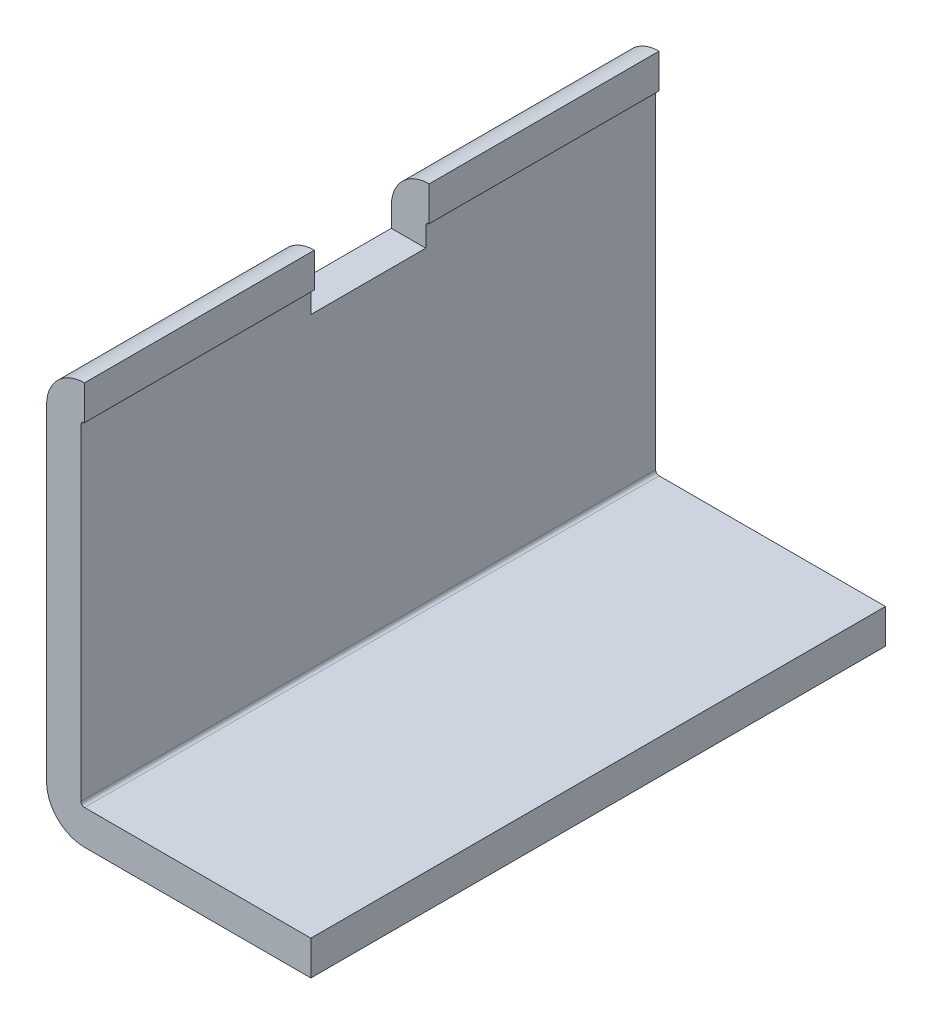
ISO-10303-21;
HEADER;
FILE_DESCRIPTION(('STEP AP214'),'2;1');
FILE_NAME('part.step','',(''),(''),'','','');
FILE_SCHEMA(('AUTOMOTIVE_DESIGN { 1 0 10303 214 1 1 1 1 }'));
ENDSEC;
DATA;
#1=APPLICATION_CONTEXT('core data for automotive mechanical design processes');
#2=APPLICATION_PROTOCOL_DEFINITION('international standard','automotive_design',2000,#1);
#3=PRODUCT_CONTEXT('',#1,'mechanical');
#4=PRODUCT('Part','Part','',(#3));
#5=PRODUCT_RELATED_PRODUCT_CATEGORY('part','',(#4));
#6=PRODUCT_DEFINITION_FORMATION('','',#4);
#7=PRODUCT_DEFINITION_CONTEXT('part definition',#1,'design');
#8=PRODUCT_DEFINITION('design','',#6,#7);
#9=PRODUCT_DEFINITION_SHAPE('','',#8);
#10=(LENGTH_UNIT() NAMED_UNIT(*) SI_UNIT(.MILLI.,.METRE.));
#11=(NAMED_UNIT(*) PLANE_ANGLE_UNIT() SI_UNIT($,.RADIAN.));
#12=(NAMED_UNIT(*) SI_UNIT($,.STERADIAN.) SOLID_ANGLE_UNIT());
#13=UNCERTAINTY_MEASURE_WITH_UNIT(LENGTH_MEASURE(1.E-05),#10,'distance_accuracy_value','');
#14=(GEOMETRIC_REPRESENTATION_CONTEXT(3) GLOBAL_UNCERTAINTY_ASSIGNED_CONTEXT((#13)) GLOBAL_UNIT_ASSIGNED_CONTEXT((#10,
#11,#12)) REPRESENTATION_CONTEXT('',''));
#15=CARTESIAN_POINT('',(0.,0.,0.));
#16=DIRECTION('',(0.,0.,1.));
#17=DIRECTION('',(1.,0.,0.));
#18=AXIS2_PLACEMENT_3D('',#15,#16,#17);
#19=CARTESIAN_POINT('',(0.03,0.,5.));
#20=DIRECTION('',(0.,0.,-1.));
#21=DIRECTION('',(-1.,0.,0.));
#22=AXIS2_PLACEMENT_3D('',#19,#20,#21);
#23=CYLINDRICAL_SURFACE('',#22,0.03);
#24=CARTESIAN_POINT('',(0.03,0.,3.));
#25=DIRECTION('',(0.,0.,1.));
#26=DIRECTION('',(1.,0.,0.));
#27=AXIS2_PLACEMENT_3D('',#24,#25,#26);
#28=CIRCLE('',#27,0.03);
#29=CARTESIAN_POINT('',(0.03,0.03,3.));
#30=VERTEX_POINT('',#29);
#31=CARTESIAN_POINT('',(0.,0.,3.));
#32=VERTEX_POINT('',#31);
#33=EDGE_CURVE('E258',#30,#32,#28,.T.);
#34=ORIENTED_EDGE('',*,*,#33,.F.);
#35=DIRECTION('',(0.,0.,-1.));
#36=VECTOR('',#35,1.);
#37=CARTESIAN_POINT('',(0.03,0.03,5.));
#38=LINE('',#37,#36);
#39=CARTESIAN_POINT('',(0.03,0.03,5.));
#40=VERTEX_POINT('',#39);
#41=EDGE_CURVE('E197',#40,#30,#38,.T.);
#42=ORIENTED_EDGE('',*,*,#41,.F.);
#43=CARTESIAN_POINT('',(0.03,0.,5.));
#44=DIRECTION('',(0.,0.,1.));
#45=DIRECTION('',(-1.,0.,0.));
#46=AXIS2_PLACEMENT_3D('',#43,#44,#45);
#47=CIRCLE('',#46,0.03);
#48=CARTESIAN_POINT('',(0.,0.,5.));
#49=VERTEX_POINT('',#48);
#50=EDGE_CURVE('E237',#40,#49,#47,.T.);
#51=ORIENTED_EDGE('',*,*,#50,.T.);
#52=DIRECTION('',(0.,0.,-1.));
#53=VECTOR('',#52,1.);
#54=CARTESIAN_POINT('',(0.,0.,5.));
#55=LINE('',#54,#53);
#56=EDGE_CURVE('E201',#49,#32,#55,.T.);
#57=ORIENTED_EDGE('',*,*,#56,.T.);
#58=EDGE_LOOP('',(#34,#42,#51,#57));
#59=FACE_BOUND('',#58,.T.);
#60=ADVANCED_FACE('F41',(#59),#23,.F.);
#61=CARTESIAN_POINT('',(0.0299999999999999,0.33,5.));
#62=DIRECTION('',(1.,0.,0.));
#63=DIRECTION('',(0.,1.,0.));
#64=AXIS2_PLACEMENT_3D('',#61,#62,#63);
#65=PLANE('',#64);
#66=DIRECTION('',(0.,-1.,0.));
#67=VECTOR('',#66,1.);
#68=CARTESIAN_POINT('',(0.0299999999999999,0.33,3.));
#69=LINE('',#68,#67);
#70=CARTESIAN_POINT('',(0.03,0.33,3.));
#71=VERTEX_POINT('',#70);
#72=EDGE_CURVE('E245',#71,#30,#69,.T.);
#73=ORIENTED_EDGE('',*,*,#72,.F.);
#74=DIRECTION('',(0.,0.,-1.));
#75=VECTOR('',#74,1.);
#76=CARTESIAN_POINT('',(0.0299999999999999,0.33,5.));
#77=LINE('',#76,#75);
#78=CARTESIAN_POINT('',(0.0299999999999999,0.33,5.));
#79=VERTEX_POINT('',#78);
#80=EDGE_CURVE('E194',#79,#71,#77,.T.);
#81=ORIENTED_EDGE('',*,*,#80,.F.);
#82=DIRECTION('',(0.,-1.,0.));
#83=VECTOR('',#82,1.);
#84=CARTESIAN_POINT('',(0.0299999999999999,0.33,5.));
#85=LINE('',#84,#83);
#86=EDGE_CURVE('E142',#79,#40,#85,.T.);
#87=ORIENTED_EDGE('',*,*,#86,.T.);
#88=ORIENTED_EDGE('',*,*,#41,.T.);
#89=EDGE_LOOP('',(#73,#81,#87,#88));
#90=FACE_BOUND('',#89,.T.);
#91=ADVANCED_FACE('F241',(#90),#65,.T.);
#92=CARTESIAN_POINT('',(0.03,0.,5.));
#93=DIRECTION('',(0.,0.,-1.));
#94=DIRECTION('',(-1.,0.,0.));
#95=AXIS2_PLACEMENT_3D('',#92,#93,#94);
#96=CYLINDRICAL_SURFACE('',#95,0.33);
#97=ORIENTED_EDGE('',*,*,#80,.T.);
#98=CARTESIAN_POINT('',(0.03,0.,3.));
#99=DIRECTION('',(0.,0.,1.));
#100=DIRECTION('',(1.,0.,0.));
#101=AXIS2_PLACEMENT_3D('',#98,#99,#100);
#102=CIRCLE('',#101,0.33);
#103=CARTESIAN_POINT('',(-0.3,0.,3.));
#104=VERTEX_POINT('',#103);
#105=EDGE_CURVE('E152',#71,#104,#102,.T.);
#106=ORIENTED_EDGE('',*,*,#105,.T.);
#107=DIRECTION('',(0.,0.,-1.));
#108=VECTOR('',#107,1.);
#109=CARTESIAN_POINT('',(-0.3,0.,5.));
#110=LINE('',#109,#108);
#111=CARTESIAN_POINT('',(-0.3,0.,5.));
#112=VERTEX_POINT('',#111);
#113=EDGE_CURVE('E148',#112,#104,#110,.T.);
#114=ORIENTED_EDGE('',*,*,#113,.F.);
#115=CARTESIAN_POINT('',(0.03,0.,5.));
#116=DIRECTION('',(0.,0.,1.));
#117=DIRECTION('',(1.,0.,0.));
#118=AXIS2_PLACEMENT_3D('',#115,#116,#117);
#119=CIRCLE('',#118,0.33);
#120=EDGE_CURVE('E134',#79,#112,#119,.T.);
#121=ORIENTED_EDGE('',*,*,#120,.F.);
#122=EDGE_LOOP('',(#97,#106,#114,#121));
#123=FACE_BOUND('',#122,.T.);
#124=ADVANCED_FACE('F149',(#123),#96,.T.);
#125=CARTESIAN_POINT('',(0.0300000000000003,-3.17,5.));
#126=DIRECTION('',(0.,1.,0.));
#127=DIRECTION('',(-1.,0.,0.));
#128=AXIS2_PLACEMENT_3D('',#125,#126,#127);
#129=PLANE('',#128);
#130=DIRECTION('',(1.,0.,0.));
#131=VECTOR('',#130,1.);
#132=CARTESIAN_POINT('',(0.0300000000000003,-3.17,0.));
#133=LINE('',#132,#131);
#134=CARTESIAN_POINT('',(0.0300000000000003,-3.17,0.));
#135=VERTEX_POINT('',#134);
#136=CARTESIAN_POINT('',(2.,-3.17,0.));
#137=VERTEX_POINT('',#136);
#138=EDGE_CURVE('E164',#135,#137,#133,.T.);
#139=ORIENTED_EDGE('',*,*,#138,.T.);
#140=DIRECTION('',(0.,0.,-1.));
#141=VECTOR('',#140,1.);
#142=CARTESIAN_POINT('',(2.,-3.17,5.));
#143=LINE('',#142,#141);
#144=CARTESIAN_POINT('',(2.,-3.17,5.));
#145=VERTEX_POINT('',#144);
#146=EDGE_CURVE('E49',#145,#137,#143,.T.);
#147=ORIENTED_EDGE('',*,*,#146,.F.);
#148=DIRECTION('',(1.,0.,0.));
#149=VECTOR('',#148,1.);
#150=CARTESIAN_POINT('',(0.0300000000000003,-3.17,5.));
#151=LINE('',#150,#149);
#152=CARTESIAN_POINT('',(0.0300000000000003,-3.17,5.));
#153=VERTEX_POINT('',#152);
#154=EDGE_CURVE('E110',#153,#145,#151,.T.);
#155=ORIENTED_EDGE('',*,*,#154,.F.);
#156=DIRECTION('',(0.,0.,-1.));
#157=VECTOR('',#156,1.);
#158=CARTESIAN_POINT('',(0.0300000000000003,-3.17,5.));
#159=LINE('',#158,#157);
#160=EDGE_CURVE('E160',#153,#135,#159,.T.);
#161=ORIENTED_EDGE('',*,*,#160,.T.);
#162=EDGE_LOOP('',(#139,#147,#155,#161));
#163=FACE_BOUND('',#162,.T.);
#164=ADVANCED_FACE('F43',(#163),#129,.F.);
#165=CARTESIAN_POINT('',(2.,-2.87,5.));
#166=DIRECTION('',(1.,0.,0.));
#167=DIRECTION('',(0.,1.,0.));
#168=AXIS2_PLACEMENT_3D('',#165,#166,#167);
#169=PLANE('',#168);
#170=DIRECTION('',(0.,-1.,0.));
#171=VECTOR('',#170,1.);
#172=CARTESIAN_POINT('',(2.,-2.87,0.));
#173=LINE('',#172,#171);
#174=CARTESIAN_POINT('',(2.,-2.87,0.));
#175=VERTEX_POINT('',#174);
#176=EDGE_CURVE('E167',#175,#137,#173,.T.);
#177=ORIENTED_EDGE('',*,*,#176,.F.);
#178=DIRECTION('',(0.,0.,-1.));
#179=VECTOR('',#178,1.);
#180=CARTESIAN_POINT('',(2.,-2.87,5.));
#181=LINE('',#180,#179);
#182=CARTESIAN_POINT('',(2.,-2.87,5.));
#183=VERTEX_POINT('',#182);
#184=EDGE_CURVE('E208',#183,#175,#181,.T.);
#185=ORIENTED_EDGE('',*,*,#184,.F.);
#186=DIRECTION('',(0.,-1.,0.));
#187=VECTOR('',#186,1.);
#188=CARTESIAN_POINT('',(2.,-2.87,5.));
#189=LINE('',#188,#187);
#190=EDGE_CURVE('E213',#183,#145,#189,.T.);
#191=ORIENTED_EDGE('',*,*,#190,.T.);
#192=ORIENTED_EDGE('',*,*,#146,.T.);
#193=EDGE_LOOP('',(#177,#185,#191,#192));
#194=FACE_BOUND('',#193,.T.);
#195=ADVANCED_FACE('F212',(#194),#169,.T.);
#196=CARTESIAN_POINT('',(0.0300000000000003,-2.87,5.));
#197=DIRECTION('',(0.,1.,0.));
#198=DIRECTION('',(-1.,0.,0.));
#199=AXIS2_PLACEMENT_3D('',#196,#197,#198);
#200=PLANE('',#199);
#201=DIRECTION('',(1.,0.,0.));
#202=VECTOR('',#201,1.);
#203=CARTESIAN_POINT('',(0.0300000000000003,-2.87,0.));
#204=LINE('',#203,#202);
#205=CARTESIAN_POINT('',(0.0300000000000003,-2.87,0.));
#206=VERTEX_POINT('',#205);
#207=EDGE_CURVE('E171',#206,#175,#204,.T.);
#208=ORIENTED_EDGE('',*,*,#207,.F.);
#209=DIRECTION('',(0.,0.,-1.));
#210=VECTOR('',#209,1.);
#211=CARTESIAN_POINT('',(0.0300000000000003,-2.87,5.));
#212=LINE('',#211,#210);
#213=CARTESIAN_POINT('',(0.0300000000000003,-2.87,5.));
#214=VERTEX_POINT('',#213);
#215=EDGE_CURVE('E206',#214,#206,#212,.T.);
#216=ORIENTED_EDGE('',*,*,#215,.F.);
#217=DIRECTION('',(1.,0.,0.));
#218=VECTOR('',#217,1.);
#219=CARTESIAN_POINT('',(0.0300000000000003,-2.87,5.));
#220=LINE('',#219,#218);
#221=EDGE_CURVE('E224',#214,#183,#220,.T.);
#222=ORIENTED_EDGE('',*,*,#221,.T.);
#223=ORIENTED_EDGE('',*,*,#184,.T.);
#224=EDGE_LOOP('',(#208,#216,#222,#223));
#225=FACE_BOUND('',#224,.T.);
#226=ADVANCED_FACE('F221',(#225),#200,.T.);
#227=CARTESIAN_POINT('',(0.0300000000000003,-2.84,5.));
#228=DIRECTION('',(0.,0.,-1.));
#229=DIRECTION('',(-1.,0.,0.));
#230=AXIS2_PLACEMENT_3D('',#227,#228,#229);
#231=CYLINDRICAL_SURFACE('',#230,0.0299999999999998);
#232=CARTESIAN_POINT('',(0.0300000000000003,-2.84,0.));
#233=DIRECTION('',(0.,0.,1.));
#234=DIRECTION('',(1.,0.,0.));
#235=AXIS2_PLACEMENT_3D('',#232,#233,#234);
#236=CIRCLE('',#235,0.0299999999999998);
#237=CARTESIAN_POINT('',(0.,-2.84,0.));
#238=VERTEX_POINT('',#237);
#239=EDGE_CURVE('E174',#238,#206,#236,.T.);
#240=ORIENTED_EDGE('',*,*,#239,.F.);
#241=DIRECTION('',(0.,0.,-1.));
#242=VECTOR('',#241,1.);
#243=CARTESIAN_POINT('',(0.,-2.84,5.));
#244=LINE('',#243,#242);
#245=CARTESIAN_POINT('',(0.,-2.84,5.));
#246=VERTEX_POINT('',#245);
#247=EDGE_CURVE('E204',#246,#238,#244,.T.);
#248=ORIENTED_EDGE('',*,*,#247,.F.);
#249=CARTESIAN_POINT('',(0.0300000000000003,-2.84,5.));
#250=DIRECTION('',(0.,0.,1.));
#251=DIRECTION('',(1.,0.,0.));
#252=AXIS2_PLACEMENT_3D('',#249,#250,#251);
#253=CIRCLE('',#252,0.0299999999999998);
#254=EDGE_CURVE('E228',#246,#214,#253,.T.);
#255=ORIENTED_EDGE('',*,*,#254,.T.);
#256=ORIENTED_EDGE('',*,*,#215,.T.);
#257=EDGE_LOOP('',(#240,#248,#255,#256));
#258=FACE_BOUND('',#257,.T.);
#259=ADVANCED_FACE('F276',(#258),#231,.F.);
#260=CARTESIAN_POINT('',(0.,0.,5.));
#261=DIRECTION('',(1.,0.,0.));
#262=DIRECTION('',(0.,1.,0.));
#263=AXIS2_PLACEMENT_3D('',#260,#261,#262);
#264=PLANE('',#263);
#265=DIRECTION('',(0.,-1.,0.));
#266=VECTOR('',#265,1.);
#267=CARTESIAN_POINT('',(0.,0.,3.));
#268=LINE('',#267,#266);
#269=CARTESIAN_POINT('',(0.,-0.17,3.));
#270=VERTEX_POINT('',#269);
#271=EDGE_CURVE('E168',#32,#270,#268,.T.);
#272=ORIENTED_EDGE('',*,*,#271,.F.);
#273=ORIENTED_EDGE('',*,*,#56,.F.);
#274=DIRECTION('',(0.,-1.,0.));
#275=VECTOR('',#274,1.);
#276=CARTESIAN_POINT('',(0.,0.,5.));
#277=LINE('',#276,#275);
#278=EDGE_CURVE('E234',#49,#246,#277,.T.);
#279=ORIENTED_EDGE('',*,*,#278,.T.);
#280=ORIENTED_EDGE('',*,*,#247,.T.);
#281=DIRECTION('',(0.,-1.,0.));
#282=VECTOR('',#281,1.);
#283=CARTESIAN_POINT('',(0.,0.,0.));
#284=LINE('',#283,#282);
#285=CARTESIAN_POINT('',(0.,0.,0.));
#286=VERTEX_POINT('',#285);
#287=EDGE_CURVE('E177',#286,#238,#284,.T.);
#288=ORIENTED_EDGE('',*,*,#287,.F.);
#289=CARTESIAN_POINT('',(0.,0.,2.));
#290=VERTEX_POINT('',#289);
#291=EDGE_CURVE('E200',#290,#286,#55,.T.);
#292=ORIENTED_EDGE('',*,*,#291,.F.);
#293=DIRECTION('',(0.,1.,0.));
#294=VECTOR('',#293,1.);
#295=CARTESIAN_POINT('',(0.,0.,2.));
#296=LINE('',#295,#294);
#297=CARTESIAN_POINT('',(0.,-0.17,2.));
#298=VERTEX_POINT('',#297);
#299=EDGE_CURVE('E287',#298,#290,#296,.T.);
#300=ORIENTED_EDGE('',*,*,#299,.F.);
#301=DIRECTION('',(0.,0.,-1.));
#302=VECTOR('',#301,1.);
#303=CARTESIAN_POINT('',(0.,-0.17,5.));
#304=LINE('',#303,#302);
#305=EDGE_CURVE('E272',#270,#298,#304,.T.);
#306=ORIENTED_EDGE('',*,*,#305,.F.);
#307=EDGE_LOOP('',(#272,#273,#279,#280,#288,#292,#300,#306));
#308=FACE_BOUND('',#307,.T.);
#309=ADVANCED_FACE('F268',(#308),#264,.T.);
#310=CARTESIAN_POINT('',(0.03,0.,2.));
#311=DIRECTION('',(0.,0.,-1.));
#312=DIRECTION('',(-1.,0.,0.));
#313=AXIS2_PLACEMENT_3D('',#310,#311,#312);
#314=CIRCLE('',#313,0.03);
#315=CARTESIAN_POINT('',(0.03,0.03,2.));
#316=VERTEX_POINT('',#315);
#317=EDGE_CURVE('E285',#290,#316,#314,.T.);
#318=ORIENTED_EDGE('',*,*,#317,.F.);
#319=ORIENTED_EDGE('',*,*,#291,.T.);
#320=CARTESIAN_POINT('',(0.03,0.,0.));
#321=DIRECTION('',(0.,0.,1.));
#322=DIRECTION('',(-1.,0.,0.));
#323=AXIS2_PLACEMENT_3D('',#320,#321,#322);
#324=CIRCLE('',#323,0.03);
#325=CARTESIAN_POINT('',(0.03,0.03,0.));
#326=VERTEX_POINT('',#325);
#327=EDGE_CURVE('E180',#326,#286,#324,.T.);
#328=ORIENTED_EDGE('',*,*,#327,.F.);
#329=EDGE_CURVE('E196',#316,#326,#38,.T.);
#330=ORIENTED_EDGE('',*,*,#329,.F.);
#331=EDGE_LOOP('',(#318,#319,#328,#330));
#332=FACE_BOUND('',#331,.T.);
#333=ADVANCED_FACE('F283',(#332),#23,.F.);
#334=DIRECTION('',(0.,1.,0.));
#335=VECTOR('',#334,1.);
#336=CARTESIAN_POINT('',(0.0299999999999999,0.33,2.));
#337=LINE('',#336,#335);
#338=CARTESIAN_POINT('',(0.03,0.33,2.));
#339=VERTEX_POINT('',#338);
#340=EDGE_CURVE('E292',#316,#339,#337,.T.);
#341=ORIENTED_EDGE('',*,*,#340,.F.);
#342=ORIENTED_EDGE('',*,*,#329,.T.);
#343=DIRECTION('',(0.,-1.,0.));
#344=VECTOR('',#343,1.);
#345=CARTESIAN_POINT('',(0.0299999999999999,0.33,0.));
#346=LINE('',#345,#344);
#347=CARTESIAN_POINT('',(0.0299999999999999,0.33,0.));
#348=VERTEX_POINT('',#347);
#349=EDGE_CURVE('E183',#348,#326,#346,.T.);
#350=ORIENTED_EDGE('',*,*,#349,.F.);
#351=EDGE_CURVE('E154',#339,#348,#77,.T.);
#352=ORIENTED_EDGE('',*,*,#351,.F.);
#353=EDGE_LOOP('',(#341,#342,#350,#352));
#354=FACE_BOUND('',#353,.T.);
#355=ADVANCED_FACE('F323',(#354),#65,.T.);
#356=CARTESIAN_POINT('',(-0.3,0.,2.));
#357=VERTEX_POINT('',#356);
#358=CARTESIAN_POINT('',(-0.3,0.,0.));
#359=VERTEX_POINT('',#358);
#360=EDGE_CURVE('E155',#357,#359,#110,.T.);
#361=ORIENTED_EDGE('',*,*,#360,.F.);
#362=CARTESIAN_POINT('',(0.03,0.,2.));
#363=DIRECTION('',(0.,0.,-1.));
#364=DIRECTION('',(-1.,0.,0.));
#365=AXIS2_PLACEMENT_3D('',#362,#363,#364);
#366=CIRCLE('',#365,0.33);
#367=EDGE_CURVE('E298',#357,#339,#366,.T.);
#368=ORIENTED_EDGE('',*,*,#367,.T.);
#369=ORIENTED_EDGE('',*,*,#351,.T.);
#370=CARTESIAN_POINT('',(0.03,0.,0.));
#371=DIRECTION('',(0.,0.,1.));
#372=DIRECTION('',(1.,0.,0.));
#373=AXIS2_PLACEMENT_3D('',#370,#371,#372);
#374=CIRCLE('',#373,0.33);
#375=EDGE_CURVE('E186',#348,#359,#374,.T.);
#376=ORIENTED_EDGE('',*,*,#375,.T.);
#377=EDGE_LOOP('',(#361,#368,#369,#376));
#378=FACE_BOUND('',#377,.T.);
#379=ADVANCED_FACE('F325',(#378),#96,.T.);
#380=CARTESIAN_POINT('',(-0.3,0.,5.));
#381=DIRECTION('',(1.,0.,0.));
#382=DIRECTION('',(0.,1.,0.));
#383=AXIS2_PLACEMENT_3D('',#380,#381,#382);
#384=PLANE('',#383);
#385=ORIENTED_EDGE('',*,*,#113,.T.);
#386=DIRECTION('',(0.,-1.,0.));
#387=VECTOR('',#386,1.);
#388=CARTESIAN_POINT('',(-0.3,0.,3.));
#389=LINE('',#388,#387);
#390=CARTESIAN_POINT('',(-0.3,-0.17,3.));
#391=VERTEX_POINT('',#390);
#392=EDGE_CURVE('E11',#104,#391,#389,.T.);
#393=ORIENTED_EDGE('',*,*,#392,.T.);
#394=DIRECTION('',(0.,0.,-1.));
#395=VECTOR('',#394,1.);
#396=CARTESIAN_POINT('',(-0.3,-0.17,2.));
#397=LINE('',#396,#395);
#398=CARTESIAN_POINT('',(-0.3,-0.17,2.));
#399=VERTEX_POINT('',#398);
#400=EDGE_CURVE('E307',#391,#399,#397,.T.);
#401=ORIENTED_EDGE('',*,*,#400,.T.);
#402=DIRECTION('',(0.,1.,0.));
#403=VECTOR('',#402,1.);
#404=CARTESIAN_POINT('',(-0.3,-0.17,2.));
#405=LINE('',#404,#403);
#406=EDGE_CURVE('E56',#399,#357,#405,.T.);
#407=ORIENTED_EDGE('',*,*,#406,.T.);
#408=ORIENTED_EDGE('',*,*,#360,.T.);
#409=DIRECTION('',(0.,-1.,0.));
#410=VECTOR('',#409,1.);
#411=CARTESIAN_POINT('',(-0.3,0.,0.));
#412=LINE('',#411,#410);
#413=CARTESIAN_POINT('',(-0.299999999999999,-2.84,0.));
#414=VERTEX_POINT('',#413);
#415=EDGE_CURVE('E189',#359,#414,#412,.T.);
#416=ORIENTED_EDGE('',*,*,#415,.T.);
#417=DIRECTION('',(0.,0.,-1.));
#418=VECTOR('',#417,1.);
#419=CARTESIAN_POINT('',(-0.299999999999999,-2.84,5.));
#420=LINE('',#419,#418);
#421=CARTESIAN_POINT('',(-0.299999999999999,-2.84,5.));
#422=VERTEX_POINT('',#421);
#423=EDGE_CURVE('E158',#422,#414,#420,.T.);
#424=ORIENTED_EDGE('',*,*,#423,.F.);
#425=DIRECTION('',(0.,-1.,0.));
#426=VECTOR('',#425,1.);
#427=CARTESIAN_POINT('',(-0.3,0.,5.));
#428=LINE('',#427,#426);
#429=EDGE_CURVE('E138',#112,#422,#428,.T.);
#430=ORIENTED_EDGE('',*,*,#429,.F.);
#431=EDGE_LOOP('',(#385,#393,#401,#407,#408,#416,#424,#430));
#432=FACE_BOUND('',#431,.T.);
#433=ADVANCED_FACE('F157',(#432),#384,.F.);
#434=CARTESIAN_POINT('',(0.0300000000000003,-2.84,5.));
#435=DIRECTION('',(0.,0.,-1.));
#436=DIRECTION('',(-1.,0.,0.));
#437=AXIS2_PLACEMENT_3D('',#434,#435,#436);
#438=CYLINDRICAL_SURFACE('',#437,0.33);
#439=CARTESIAN_POINT('',(0.0300000000000003,-2.84,0.));
#440=DIRECTION('',(0.,0.,1.));
#441=DIRECTION('',(1.,0.,0.));
#442=AXIS2_PLACEMENT_3D('',#439,#440,#441);
#443=CIRCLE('',#442,0.33);
#444=EDGE_CURVE('E104',#414,#135,#443,.T.);
#445=ORIENTED_EDGE('',*,*,#444,.T.);
#446=ORIENTED_EDGE('',*,*,#160,.F.);
#447=CARTESIAN_POINT('',(0.0300000000000003,-2.84,5.));
#448=DIRECTION('',(0.,0.,1.));
#449=DIRECTION('',(1.,0.,0.));
#450=AXIS2_PLACEMENT_3D('',#447,#448,#449);
#451=CIRCLE('',#450,0.33);
#452=EDGE_CURVE('E65',#422,#153,#451,.T.);
#453=ORIENTED_EDGE('',*,*,#452,.F.);
#454=ORIENTED_EDGE('',*,*,#423,.T.);
#455=EDGE_LOOP('',(#445,#446,#453,#454));
#456=FACE_BOUND('',#455,.T.);
#457=ADVANCED_FACE('F327',(#456),#438,.T.);
#458=CARTESIAN_POINT('',(0.0300000000000003,-2.84,5.));
#459=DIRECTION('',(0.,0.,1.));
#460=DIRECTION('',(1.,0.,0.));
#461=AXIS2_PLACEMENT_3D('',#458,#459,#460);
#462=PLANE('',#461);
#463=ORIENTED_EDGE('',*,*,#154,.T.);
#464=ORIENTED_EDGE('',*,*,#190,.F.);
#465=ORIENTED_EDGE('',*,*,#221,.F.);
#466=ORIENTED_EDGE('',*,*,#254,.F.);
#467=ORIENTED_EDGE('',*,*,#278,.F.);
#468=ORIENTED_EDGE('',*,*,#50,.F.);
#469=ORIENTED_EDGE('',*,*,#86,.F.);
#470=ORIENTED_EDGE('',*,*,#120,.T.);
#471=ORIENTED_EDGE('',*,*,#429,.T.);
#472=ORIENTED_EDGE('',*,*,#452,.T.);
#473=EDGE_LOOP('',(#463,#464,#465,#466,#467,#468,#469,#470,#471,#472));
#474=FACE_BOUND('',#473,.T.);
#475=ADVANCED_FACE('F136',(#474),#462,.T.);
#476=CARTESIAN_POINT('',(0.0300000000000003,-2.84,0.));
#477=DIRECTION('',(0.,0.,1.));
#478=DIRECTION('',(1.,0.,0.));
#479=AXIS2_PLACEMENT_3D('',#476,#477,#478);
#480=PLANE('',#479);
#481=ORIENTED_EDGE('',*,*,#138,.F.);
#482=ORIENTED_EDGE('',*,*,#444,.F.);
#483=ORIENTED_EDGE('',*,*,#415,.F.);
#484=ORIENTED_EDGE('',*,*,#375,.F.);
#485=ORIENTED_EDGE('',*,*,#349,.T.);
#486=ORIENTED_EDGE('',*,*,#327,.T.);
#487=ORIENTED_EDGE('',*,*,#287,.T.);
#488=ORIENTED_EDGE('',*,*,#239,.T.);
#489=ORIENTED_EDGE('',*,*,#207,.T.);
#490=ORIENTED_EDGE('',*,*,#176,.T.);
#491=EDGE_LOOP('',(#481,#482,#483,#484,#485,#486,#487,#488,#489,#490));
#492=FACE_BOUND('',#491,.T.);
#493=ADVANCED_FACE('F217',(#492),#480,.F.);
#494=CARTESIAN_POINT('',(-0.3,-0.17,3.));
#495=DIRECTION('',(0.,0.,1.));
#496=DIRECTION('',(1.,0.,0.));
#497=AXIS2_PLACEMENT_3D('',#494,#495,#496);
#498=PLANE('',#497);
#499=ORIENTED_EDGE('',*,*,#271,.T.);
#500=DIRECTION('',(1.,0.,0.));
#501=VECTOR('',#500,1.);
#502=CARTESIAN_POINT('',(-0.3,-0.17,3.));
#503=LINE('',#502,#501);
#504=EDGE_CURVE('E303',#391,#270,#503,.T.);
#505=ORIENTED_EDGE('',*,*,#504,.F.);
#506=ORIENTED_EDGE('',*,*,#392,.F.);
#507=ORIENTED_EDGE('',*,*,#105,.F.);
#508=ORIENTED_EDGE('',*,*,#72,.T.);
#509=ORIENTED_EDGE('',*,*,#33,.T.);
#510=EDGE_LOOP('',(#499,#505,#506,#507,#508,#509));
#511=FACE_BOUND('',#510,.T.);
#512=ADVANCED_FACE('F260',(#511),#498,.F.);
#513=CARTESIAN_POINT('',(-0.3,-0.17,2.));
#514=DIRECTION('',(0.,0.,-1.));
#515=DIRECTION('',(-1.,0.,0.));
#516=AXIS2_PLACEMENT_3D('',#513,#514,#515);
#517=PLANE('',#516);
#518=ORIENTED_EDGE('',*,*,#299,.T.);
#519=ORIENTED_EDGE('',*,*,#317,.T.);
#520=ORIENTED_EDGE('',*,*,#340,.T.);
#521=ORIENTED_EDGE('',*,*,#367,.F.);
#522=ORIENTED_EDGE('',*,*,#406,.F.);
#523=DIRECTION('',(1.,0.,0.));
#524=VECTOR('',#523,1.);
#525=CARTESIAN_POINT('',(-0.3,-0.17,2.));
#526=LINE('',#525,#524);
#527=EDGE_CURVE('E302',#399,#298,#526,.T.);
#528=ORIENTED_EDGE('',*,*,#527,.T.);
#529=EDGE_LOOP('',(#518,#519,#520,#521,#522,#528));
#530=FACE_BOUND('',#529,.T.);
#531=ADVANCED_FACE('F320',(#530),#517,.F.);
#532=CARTESIAN_POINT('',(-0.3,-0.17,2.));
#533=DIRECTION('',(0.,-1.,0.));
#534=DIRECTION('',(0.,0.,-1.));
#535=AXIS2_PLACEMENT_3D('',#532,#533,#534);
#536=PLANE('',#535);
#537=ORIENTED_EDGE('',*,*,#305,.T.);
#538=ORIENTED_EDGE('',*,*,#527,.F.);
#539=ORIENTED_EDGE('',*,*,#400,.F.);
#540=ORIENTED_EDGE('',*,*,#504,.T.);
#541=EDGE_LOOP('',(#537,#538,#539,#540));
#542=FACE_BOUND('',#541,.T.);
#543=ADVANCED_FACE('F313',(#542),#536,.F.);
#544=CLOSED_SHELL('',(#60,#91,#124,#164,#195,#226,#259,#309,#333,#355,#379,#433,#457,#475,#493,
#512,#531,#543));
#545=MANIFOLD_SOLID_BREP('B2',#544);
#546=ADVANCED_BREP_SHAPE_REPRESENTATION('',(#18,#545),#14);
#547=SHAPE_DEFINITION_REPRESENTATION(#9,#546);
ENDSEC;
END-ISO-10303-21;
